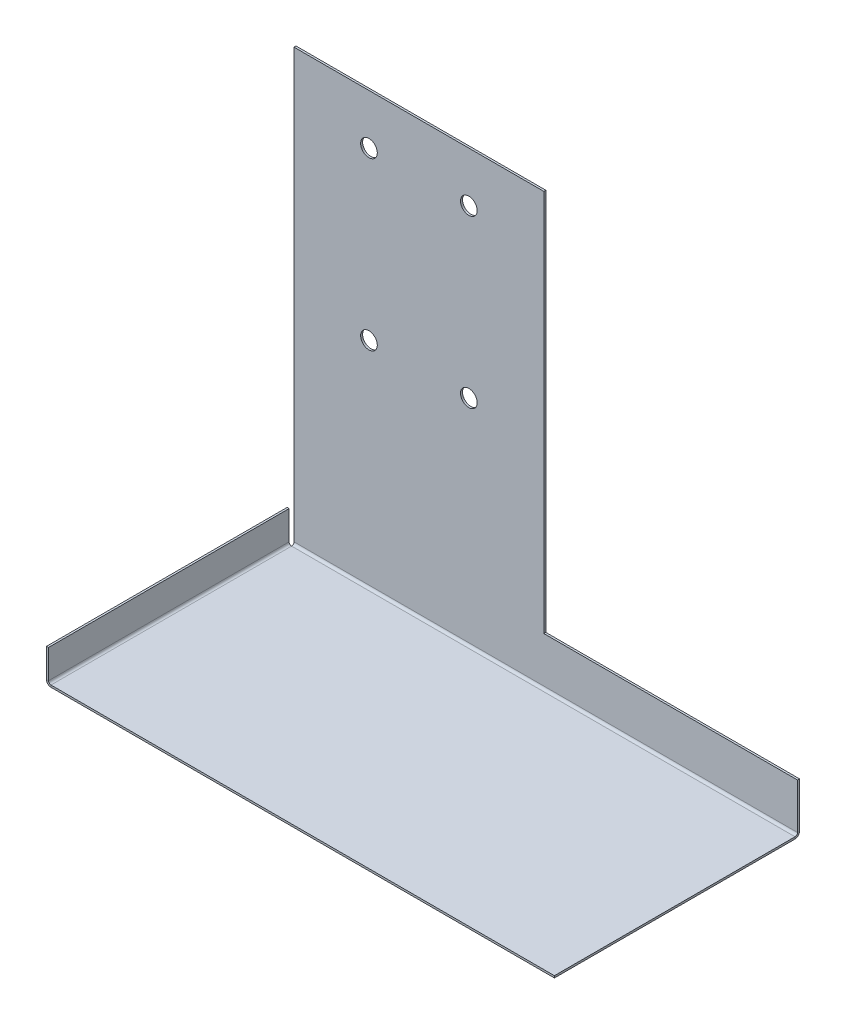
ISO-10303-21;
HEADER;
FILE_DESCRIPTION(('STEP AP214'),'2;1');
FILE_NAME('part.step','',(''),(''),'','','');
FILE_SCHEMA(('AUTOMOTIVE_DESIGN { 1 0 10303 214 1 1 1 1 }'));
ENDSEC;
DATA;
#1=APPLICATION_CONTEXT('core data for automotive mechanical design processes');
#2=APPLICATION_PROTOCOL_DEFINITION('international standard','automotive_design',2000,#1);
#3=PRODUCT_CONTEXT('',#1,'mechanical');
#4=PRODUCT('Part','Part','',(#3));
#5=PRODUCT_RELATED_PRODUCT_CATEGORY('part','',(#4));
#6=PRODUCT_DEFINITION_FORMATION('','',#4);
#7=PRODUCT_DEFINITION_CONTEXT('part definition',#1,'design');
#8=PRODUCT_DEFINITION('design','',#6,#7);
#9=PRODUCT_DEFINITION_SHAPE('','',#8);
#10=(LENGTH_UNIT() NAMED_UNIT(*) SI_UNIT(.MILLI.,.METRE.));
#11=(NAMED_UNIT(*) PLANE_ANGLE_UNIT() SI_UNIT($,.RADIAN.));
#12=(NAMED_UNIT(*) SI_UNIT($,.STERADIAN.) SOLID_ANGLE_UNIT());
#13=UNCERTAINTY_MEASURE_WITH_UNIT(LENGTH_MEASURE(1.E-05),#10,'distance_accuracy_value','');
#14=(GEOMETRIC_REPRESENTATION_CONTEXT(3) GLOBAL_UNCERTAINTY_ASSIGNED_CONTEXT((#13)) GLOBAL_UNIT_ASSIGNED_CONTEXT((#10,
#11,#12)) REPRESENTATION_CONTEXT('',''));
#15=CARTESIAN_POINT('',(0.,0.,0.));
#16=DIRECTION('',(0.,0.,1.));
#17=DIRECTION('',(1.,0.,0.));
#18=AXIS2_PLACEMENT_3D('',#15,#16,#17);
#19=CARTESIAN_POINT('',(0.,0.,-0.6));
#20=DIRECTION('',(0.,0.,-1.));
#21=DIRECTION('',(-1.,0.,0.));
#22=AXIS2_PLACEMENT_3D('',#19,#20,#21);
#23=PLANE('',#22);
#24=DIRECTION('',(1.,0.,0.));
#25=VECTOR('',#24,1.);
#26=CARTESIAN_POINT('',(151.2,1.3366,-0.6));
#27=LINE('',#26,#25);
#28=CARTESIAN_POINT('',(151.2,1.3366,-0.6));
#29=VERTEX_POINT('',#28);
#30=CARTESIAN_POINT('',(75.,1.3366,-0.6));
#31=VERTEX_POINT('',#30);
#32=EDGE_CURVE('E283',#29,#31,#27,.F.);
#33=ORIENTED_EDGE('',*,*,#32,.T.);
#34=DIRECTION('',(0.,1.,0.));
#35=VECTOR('',#34,1.);
#36=CARTESIAN_POINT('',(75.,0.,-0.6));
#37=LINE('',#36,#35);
#38=CARTESIAN_POINT('',(75.,15.,-0.6));
#39=VERTEX_POINT('',#38);
#40=EDGE_CURVE('E13',#31,#39,#37,.T.);
#41=ORIENTED_EDGE('',*,*,#40,.T.);
#42=DIRECTION('',(-1.,0.,0.));
#43=VECTOR('',#42,1.);
#44=CARTESIAN_POINT('',(75.,15.,-0.6));
#45=LINE('',#44,#43);
#46=CARTESIAN_POINT('',(151.2,15.,-0.6));
#47=VERTEX_POINT('',#46);
#48=EDGE_CURVE('E333',#47,#39,#45,.T.);
#49=ORIENTED_EDGE('',*,*,#48,.F.);
#50=DIRECTION('',(0.,1.,0.));
#51=VECTOR('',#50,1.);
#52=CARTESIAN_POINT('',(151.2,0.,-0.6));
#53=LINE('',#52,#51);
#54=EDGE_CURVE('E331',#29,#47,#53,.T.);
#55=ORIENTED_EDGE('',*,*,#54,.F.);
#56=EDGE_LOOP('',(#33,#41,#49,#55));
#57=FACE_BOUND('',#56,.T.);
#58=ADVANCED_FACE('F83',(#57),#23,.T.);
#59=CARTESIAN_POINT('',(0.,0.,0.));
#60=DIRECTION('',(0.,1.,0.));
#61=DIRECTION('',(0.,0.,1.));
#62=AXIS2_PLACEMENT_3D('',#59,#60,#61);
#63=PLANE('',#62);
#64=DIRECTION('',(0.,0.,-1.));
#65=VECTOR('',#64,1.);
#66=CARTESIAN_POINT('',(138.538767605664,0.,0.));
#67=LINE('',#66,#65);
#68=CARTESIAN_POINT('',(138.538767605664,-2.54878137735549E-13,73.));
#69=VERTEX_POINT('',#68);
#70=CARTESIAN_POINT('',(138.538767605664,-2.16898623001696E-13,62.1222346482778));
#71=VERTEX_POINT('',#70);
#72=EDGE_CURVE('E93',#69,#71,#67,.T.);
#73=ORIENTED_EDGE('',*,*,#72,.F.);
#74=DIRECTION('',(-1.,0.,0.));
#75=VECTOR('',#74,1.);
#76=CARTESIAN_POINT('',(0.,-2.54878137735549E-13,73.));
#77=LINE('',#76,#75);
#78=CARTESIAN_POINT('',(0.,-2.53703308361608E-13,73.));
#79=VERTEX_POINT('',#78);
#80=EDGE_CURVE('E258',#69,#79,#77,.T.);
#81=ORIENTED_EDGE('',*,*,#80,.T.);
#82=DIRECTION('',(0.,0.,-1.));
#83=VECTOR('',#82,1.);
#84=CARTESIAN_POINT('',(0.,0.,0.));
#85=LINE('',#84,#83);
#86=CARTESIAN_POINT('',(0.,0.,0.736599999999995));
#87=VERTEX_POINT('',#86);
#88=EDGE_CURVE('E263',#79,#87,#85,.T.);
#89=ORIENTED_EDGE('',*,*,#88,.T.);
#90=DIRECTION('',(1.,0.,0.));
#91=VECTOR('',#90,1.);
#92=CARTESIAN_POINT('',(0.,0.,0.736599999999995));
#93=LINE('',#92,#91);
#94=CARTESIAN_POINT('',(151.2,0.,0.736599999999995));
#95=VERTEX_POINT('',#94);
#96=EDGE_CURVE('E273',#95,#87,#93,.F.);
#97=ORIENTED_EDGE('',*,*,#96,.F.);
#98=DIRECTION('',(0.,0.,1.));
#99=VECTOR('',#98,1.);
#100=CARTESIAN_POINT('',(151.2,0.,0.));
#101=LINE('',#100,#99);
#102=CARTESIAN_POINT('',(151.2,-2.16898623001696E-13,62.1222346482778));
#103=VERTEX_POINT('',#102);
#104=EDGE_CURVE('E259',#95,#103,#101,.T.);
#105=ORIENTED_EDGE('',*,*,#104,.T.);
#106=DIRECTION('',(1.,0.,0.));
#107=VECTOR('',#106,1.);
#108=CARTESIAN_POINT('',(0.,-2.16898623001696E-13,62.1222346482778));
#109=LINE('',#108,#107);
#110=EDGE_CURVE('E357',#71,#103,#109,.T.);
#111=ORIENTED_EDGE('',*,*,#110,.F.);
#112=EDGE_LOOP('',(#73,#81,#89,#97,#105,#111));
#113=FACE_BOUND('',#112,.T.);
#114=ADVANCED_FACE('F421',(#113),#63,.F.);
#115=ORIENTED_EDGE('',*,*,#40,.F.);
#116=CARTESIAN_POINT('',(0.,1.3366,-0.6));
#117=VERTEX_POINT('',#116);
#118=EDGE_CURVE('E287',#31,#117,#27,.F.);
#119=ORIENTED_EDGE('',*,*,#118,.T.);
#120=DIRECTION('',(0.,-1.,0.));
#121=VECTOR('',#120,1.);
#122=CARTESIAN_POINT('',(0.,0.,-0.6));
#123=LINE('',#122,#121);
#124=CARTESIAN_POINT('',(0.,130.,-0.6));
#125=VERTEX_POINT('',#124);
#126=EDGE_CURVE('E387',#125,#117,#123,.T.);
#127=ORIENTED_EDGE('',*,*,#126,.F.);
#128=DIRECTION('',(-1.,0.,0.));
#129=VECTOR('',#128,1.);
#130=CARTESIAN_POINT('',(0.,130.,-0.6));
#131=LINE('',#130,#129);
#132=CARTESIAN_POINT('',(75.,130.,-0.6));
#133=VERTEX_POINT('',#132);
#134=EDGE_CURVE('E376',#133,#125,#131,.T.);
#135=ORIENTED_EDGE('',*,*,#134,.F.);
#136=DIRECTION('',(0.,1.,0.));
#137=VECTOR('',#136,1.);
#138=CARTESIAN_POINT('',(75.,0.,-0.6));
#139=LINE('',#138,#137);
#140=EDGE_CURVE('E346',#39,#133,#139,.T.);
#141=ORIENTED_EDGE('',*,*,#140,.F.);
#142=EDGE_LOOP('',(#115,#119,#127,#135,#141));
#143=FACE_BOUND('',#142,.T.);
#144=CARTESIAN_POINT('',(22.5,65.,-0.6));
#145=DIRECTION('',(0.,0.,-1.));
#146=DIRECTION('',(-1.,0.,0.));
#147=AXIS2_PLACEMENT_3D('',#144,#145,#146);
#148=CIRCLE('',#147,2.5);
#149=CARTESIAN_POINT('',(20.,65.,-0.6));
#150=VERTEX_POINT('',#149);
#151=EDGE_CURVE('E324',#150,#150,#148,.T.);
#152=ORIENTED_EDGE('',*,*,#151,.F.);
#153=EDGE_LOOP('',(#152));
#154=FACE_BOUND('',#153,.T.);
#155=CARTESIAN_POINT('',(52.5,115.,-0.6));
#156=DIRECTION('',(0.,0.,-1.));
#157=DIRECTION('',(-1.,0.,0.));
#158=AXIS2_PLACEMENT_3D('',#155,#156,#157);
#159=CIRCLE('',#158,2.5);
#160=CARTESIAN_POINT('',(50.,115.,-0.6));
#161=VERTEX_POINT('',#160);
#162=EDGE_CURVE('E318',#161,#161,#159,.T.);
#163=ORIENTED_EDGE('',*,*,#162,.F.);
#164=EDGE_LOOP('',(#163));
#165=FACE_BOUND('',#164,.T.);
#166=CARTESIAN_POINT('',(52.5,65.,-0.6));
#167=DIRECTION('',(0.,0.,-1.));
#168=DIRECTION('',(1.,0.,0.));
#169=AXIS2_PLACEMENT_3D('',#166,#167,#168);
#170=CIRCLE('',#169,2.49999999999999);
#171=CARTESIAN_POINT('',(55.,65.,-0.6));
#172=VERTEX_POINT('',#171);
#173=EDGE_CURVE('E312',#172,#172,#170,.T.);
#174=ORIENTED_EDGE('',*,*,#173,.F.);
#175=EDGE_LOOP('',(#174));
#176=FACE_BOUND('',#175,.T.);
#177=CARTESIAN_POINT('',(22.5,115.,-0.6));
#178=DIRECTION('',(0.,0.,-1.));
#179=DIRECTION('',(1.,0.,0.));
#180=AXIS2_PLACEMENT_3D('',#177,#178,#179);
#181=CIRCLE('',#180,2.5);
#182=CARTESIAN_POINT('',(25.,115.,-0.6));
#183=VERTEX_POINT('',#182);
#184=EDGE_CURVE('E304',#183,#183,#181,.T.);
#185=ORIENTED_EDGE('',*,*,#184,.F.);
#186=EDGE_LOOP('',(#185));
#187=FACE_BOUND('',#186,.T.);
#188=ADVANCED_FACE('F400',(#143,#154,#165,#176,#187),#23,.T.);
#189=CARTESIAN_POINT('',(0.,0.,0.));
#190=DIRECTION('',(0.,0.,-1.));
#191=DIRECTION('',(-1.,0.,0.));
#192=AXIS2_PLACEMENT_3D('',#189,#190,#191);
#193=PLANE('',#192);
#194=CARTESIAN_POINT('',(22.5,65.,0.));
#195=DIRECTION('',(0.,0.,-1.));
#196=DIRECTION('',(-1.,0.,0.));
#197=AXIS2_PLACEMENT_3D('',#194,#195,#196);
#198=CIRCLE('',#197,2.5);
#199=CARTESIAN_POINT('',(20.,65.,0.));
#200=VERTEX_POINT('',#199);
#201=EDGE_CURVE('E327',#200,#200,#198,.F.);
#202=ORIENTED_EDGE('',*,*,#201,.F.);
#203=EDGE_LOOP('',(#202));
#204=FACE_BOUND('',#203,.T.);
#205=CARTESIAN_POINT('',(52.5,115.,0.));
#206=DIRECTION('',(0.,0.,-1.));
#207=DIRECTION('',(-1.,0.,0.));
#208=AXIS2_PLACEMENT_3D('',#205,#206,#207);
#209=CIRCLE('',#208,2.5);
#210=CARTESIAN_POINT('',(50.,115.,0.));
#211=VERTEX_POINT('',#210);
#212=EDGE_CURVE('E321',#211,#211,#209,.F.);
#213=ORIENTED_EDGE('',*,*,#212,.F.);
#214=EDGE_LOOP('',(#213));
#215=FACE_BOUND('',#214,.T.);
#216=CARTESIAN_POINT('',(52.5,65.,0.));
#217=DIRECTION('',(0.,0.,-1.));
#218=DIRECTION('',(-1.,0.,0.));
#219=AXIS2_PLACEMENT_3D('',#216,#217,#218);
#220=CIRCLE('',#219,2.49999999999999);
#221=CARTESIAN_POINT('',(50.,65.,0.));
#222=VERTEX_POINT('',#221);
#223=EDGE_CURVE('E315',#222,#222,#220,.F.);
#224=ORIENTED_EDGE('',*,*,#223,.F.);
#225=EDGE_LOOP('',(#224));
#226=FACE_BOUND('',#225,.T.);
#227=CARTESIAN_POINT('',(22.5,115.,0.));
#228=DIRECTION('',(0.,0.,-1.));
#229=DIRECTION('',(-1.,0.,0.));
#230=AXIS2_PLACEMENT_3D('',#227,#228,#229);
#231=CIRCLE('',#230,2.5);
#232=CARTESIAN_POINT('',(20.,115.,0.));
#233=VERTEX_POINT('',#232);
#234=EDGE_CURVE('E309',#233,#233,#231,.F.);
#235=ORIENTED_EDGE('',*,*,#234,.F.);
#236=EDGE_LOOP('',(#235));
#237=FACE_BOUND('',#236,.T.);
#238=DIRECTION('',(1.,0.,0.));
#239=VECTOR('',#238,1.);
#240=CARTESIAN_POINT('',(151.2,1.3366,0.));
#241=LINE('',#240,#239);
#242=CARTESIAN_POINT('',(151.2,1.3366,0.));
#243=VERTEX_POINT('',#242);
#244=CARTESIAN_POINT('',(0.,1.3366,0.));
#245=VERTEX_POINT('',#244);
#246=EDGE_CURVE('E297',#243,#245,#241,.F.);
#247=ORIENTED_EDGE('',*,*,#246,.F.);
#248=DIRECTION('',(0.,1.,0.));
#249=VECTOR('',#248,1.);
#250=CARTESIAN_POINT('',(151.2,0.,0.));
#251=LINE('',#250,#249);
#252=CARTESIAN_POINT('',(151.2,15.,0.));
#253=VERTEX_POINT('',#252);
#254=EDGE_CURVE('E330',#243,#253,#251,.T.);
#255=ORIENTED_EDGE('',*,*,#254,.T.);
#256=DIRECTION('',(-1.,0.,0.));
#257=VECTOR('',#256,1.);
#258=CARTESIAN_POINT('',(75.,15.,0.));
#259=LINE('',#258,#257);
#260=CARTESIAN_POINT('',(75.,15.,0.));
#261=VERTEX_POINT('',#260);
#262=EDGE_CURVE('E334',#253,#261,#259,.T.);
#263=ORIENTED_EDGE('',*,*,#262,.T.);
#264=DIRECTION('',(0.,1.,0.));
#265=VECTOR('',#264,1.);
#266=CARTESIAN_POINT('',(75.,0.,0.));
#267=LINE('',#266,#265);
#268=CARTESIAN_POINT('',(75.,130.,0.));
#269=VERTEX_POINT('',#268);
#270=EDGE_CURVE('E381',#261,#269,#267,.T.);
#271=ORIENTED_EDGE('',*,*,#270,.T.);
#272=DIRECTION('',(-1.,0.,0.));
#273=VECTOR('',#272,1.);
#274=CARTESIAN_POINT('',(0.,130.,0.));
#275=LINE('',#274,#273);
#276=CARTESIAN_POINT('',(0.,130.,0.));
#277=VERTEX_POINT('',#276);
#278=EDGE_CURVE('E379',#269,#277,#275,.T.);
#279=ORIENTED_EDGE('',*,*,#278,.T.);
#280=DIRECTION('',(0.,-1.,0.));
#281=VECTOR('',#280,1.);
#282=CARTESIAN_POINT('',(0.,0.,0.));
#283=LINE('',#282,#281);
#284=EDGE_CURVE('E345',#277,#245,#283,.T.);
#285=ORIENTED_EDGE('',*,*,#284,.T.);
#286=EDGE_LOOP('',(#247,#255,#263,#271,#279,#285));
#287=FACE_BOUND('',#286,.T.);
#288=ADVANCED_FACE('F395',(#204,#215,#226,#237,#287),#193,.F.);
#289=CARTESIAN_POINT('',(151.2,0.,-0.6));
#290=DIRECTION('',(1.,0.,0.));
#291=DIRECTION('',(0.,0.,-1.));
#292=AXIS2_PLACEMENT_3D('',#289,#290,#291);
#293=PLANE('',#292);
#294=ORIENTED_EDGE('',*,*,#254,.F.);
#295=DIRECTION('',(0.,0.,-1.));
#296=VECTOR('',#295,1.);
#297=CARTESIAN_POINT('',(151.2,1.3366,0.));
#298=LINE('',#297,#296);
#299=EDGE_CURVE('E290',#243,#29,#298,.T.);
#300=ORIENTED_EDGE('',*,*,#299,.T.);
#301=ORIENTED_EDGE('',*,*,#54,.T.);
#302=DIRECTION('',(0.,0.,1.));
#303=VECTOR('',#302,1.);
#304=CARTESIAN_POINT('',(151.2,15.,-0.6));
#305=LINE('',#304,#303);
#306=EDGE_CURVE('E338',#47,#253,#305,.T.);
#307=ORIENTED_EDGE('',*,*,#306,.T.);
#308=EDGE_LOOP('',(#294,#300,#301,#307));
#309=FACE_BOUND('',#308,.T.);
#310=ADVANCED_FACE('F411',(#309),#293,.T.);
#311=CARTESIAN_POINT('',(0.,0.,-0.6));
#312=DIRECTION('',(-1.,0.,0.));
#313=DIRECTION('',(0.,0.,1.));
#314=AXIS2_PLACEMENT_3D('',#311,#312,#313);
#315=PLANE('',#314);
#316=DIRECTION('',(0.,0.,-1.));
#317=VECTOR('',#316,1.);
#318=CARTESIAN_POINT('',(0.,1.3366,0.));
#319=LINE('',#318,#317);
#320=EDGE_CURVE('E301',#245,#117,#319,.T.);
#321=ORIENTED_EDGE('',*,*,#320,.F.);
#322=ORIENTED_EDGE('',*,*,#284,.F.);
#323=DIRECTION('',(0.,0.,1.));
#324=VECTOR('',#323,1.);
#325=CARTESIAN_POINT('',(0.,130.,-0.6));
#326=LINE('',#325,#324);
#327=EDGE_CURVE('E360',#125,#277,#326,.T.);
#328=ORIENTED_EDGE('',*,*,#327,.F.);
#329=ORIENTED_EDGE('',*,*,#126,.T.);
#330=EDGE_LOOP('',(#321,#322,#328,#329));
#331=FACE_BOUND('',#330,.T.);
#332=ADVANCED_FACE('F85',(#331),#315,.T.);
#333=CARTESIAN_POINT('',(0.,130.,-0.6));
#334=DIRECTION('',(0.,1.,0.));
#335=DIRECTION('',(0.,0.,1.));
#336=AXIS2_PLACEMENT_3D('',#333,#334,#335);
#337=PLANE('',#336);
#338=ORIENTED_EDGE('',*,*,#278,.F.);
#339=DIRECTION('',(0.,0.,1.));
#340=VECTOR('',#339,1.);
#341=CARTESIAN_POINT('',(75.,130.,-0.6));
#342=LINE('',#341,#340);
#343=EDGE_CURVE('E369',#133,#269,#342,.T.);
#344=ORIENTED_EDGE('',*,*,#343,.F.);
#345=ORIENTED_EDGE('',*,*,#134,.T.);
#346=ORIENTED_EDGE('',*,*,#327,.T.);
#347=EDGE_LOOP('',(#338,#344,#345,#346));
#348=FACE_BOUND('',#347,.T.);
#349=ADVANCED_FACE('F397',(#348),#337,.T.);
#350=CARTESIAN_POINT('',(75.,0.,-0.6));
#351=DIRECTION('',(1.,0.,0.));
#352=DIRECTION('',(0.,0.,-1.));
#353=AXIS2_PLACEMENT_3D('',#350,#351,#352);
#354=PLANE('',#353);
#355=DIRECTION('',(0.,0.,1.));
#356=VECTOR('',#355,1.);
#357=CARTESIAN_POINT('',(75.,15.,-0.6));
#358=LINE('',#357,#356);
#359=EDGE_CURVE('E341',#39,#261,#358,.T.);
#360=ORIENTED_EDGE('',*,*,#359,.F.);
#361=ORIENTED_EDGE('',*,*,#140,.T.);
#362=ORIENTED_EDGE('',*,*,#343,.T.);
#363=ORIENTED_EDGE('',*,*,#270,.F.);
#364=EDGE_LOOP('',(#360,#361,#362,#363));
#365=FACE_BOUND('',#364,.T.);
#366=ADVANCED_FACE('F416',(#365),#354,.T.);
#367=CARTESIAN_POINT('',(75.,15.,-0.6));
#368=DIRECTION('',(0.,1.,0.));
#369=DIRECTION('',(0.,0.,1.));
#370=AXIS2_PLACEMENT_3D('',#367,#368,#369);
#371=PLANE('',#370);
#372=ORIENTED_EDGE('',*,*,#262,.F.);
#373=ORIENTED_EDGE('',*,*,#306,.F.);
#374=ORIENTED_EDGE('',*,*,#48,.T.);
#375=ORIENTED_EDGE('',*,*,#359,.T.);
#376=EDGE_LOOP('',(#372,#373,#374,#375));
#377=FACE_BOUND('',#376,.T.);
#378=ADVANCED_FACE('F442',(#377),#371,.T.);
#379=CARTESIAN_POINT('',(22.5,65.,0.00105000000000005));
#380=DIRECTION('',(0.,0.,-1.));
#381=DIRECTION('',(-1.,0.,0.));
#382=AXIS2_PLACEMENT_3D('',#379,#380,#381);
#383=CYLINDRICAL_SURFACE('',#382,2.5);
#384=ORIENTED_EDGE('',*,*,#151,.T.);
#385=EDGE_LOOP('',(#384));
#386=FACE_BOUND('',#385,.T.);
#387=ORIENTED_EDGE('',*,*,#201,.T.);
#388=EDGE_LOOP('',(#387));
#389=FACE_BOUND('',#388,.T.);
#390=ADVANCED_FACE('F446',(#386,#389),#383,.F.);
#391=CARTESIAN_POINT('',(52.5,115.,0.00105000000000005));
#392=DIRECTION('',(0.,0.,-1.));
#393=DIRECTION('',(-1.,0.,0.));
#394=AXIS2_PLACEMENT_3D('',#391,#392,#393);
#395=CYLINDRICAL_SURFACE('',#394,2.5);
#396=ORIENTED_EDGE('',*,*,#162,.T.);
#397=EDGE_LOOP('',(#396));
#398=FACE_BOUND('',#397,.T.);
#399=ORIENTED_EDGE('',*,*,#212,.T.);
#400=EDGE_LOOP('',(#399));
#401=FACE_BOUND('',#400,.T.);
#402=ADVANCED_FACE('F521',(#398,#401),#395,.F.);
#403=CARTESIAN_POINT('',(52.5,65.,0.00105000000000005));
#404=DIRECTION('',(0.,0.,-1.));
#405=DIRECTION('',(-1.,0.,0.));
#406=AXIS2_PLACEMENT_3D('',#403,#404,#405);
#407=CYLINDRICAL_SURFACE('',#406,2.49999999999999);
#408=ORIENTED_EDGE('',*,*,#173,.T.);
#409=EDGE_LOOP('',(#408));
#410=FACE_BOUND('',#409,.T.);
#411=ORIENTED_EDGE('',*,*,#223,.T.);
#412=EDGE_LOOP('',(#411));
#413=FACE_BOUND('',#412,.T.);
#414=ADVANCED_FACE('F517',(#410,#413),#407,.F.);
#415=CARTESIAN_POINT('',(22.5,115.,0.00105000000000005));
#416=DIRECTION('',(0.,0.,-1.));
#417=DIRECTION('',(-1.,0.,0.));
#418=AXIS2_PLACEMENT_3D('',#415,#416,#417);
#419=CYLINDRICAL_SURFACE('',#418,2.5);
#420=ORIENTED_EDGE('',*,*,#184,.T.);
#421=EDGE_LOOP('',(#420));
#422=FACE_BOUND('',#421,.T.);
#423=ORIENTED_EDGE('',*,*,#234,.T.);
#424=EDGE_LOOP('',(#423));
#425=FACE_BOUND('',#424,.T.);
#426=ADVANCED_FACE('F512',(#422,#425),#419,.F.);
#427=CARTESIAN_POINT('',(0.,1.3366,0.7366));
#428=DIRECTION('',(-1.,0.,0.));
#429=DIRECTION('',(0.,0.,1.));
#430=AXIS2_PLACEMENT_3D('',#427,#428,#429);
#431=PLANE('',#430);
#432=DIRECTION('',(0.,1.,0.));
#433=VECTOR('',#432,1.);
#434=CARTESIAN_POINT('',(0.,0.,0.736599999999995));
#435=LINE('',#434,#433);
#436=CARTESIAN_POINT('',(0.,0.600000000000001,0.736600000000004));
#437=VERTEX_POINT('',#436);
#438=EDGE_CURVE('E240',#437,#87,#435,.F.);
#439=ORIENTED_EDGE('',*,*,#438,.F.);
#440=CARTESIAN_POINT('',(0.,1.3366,0.7366));
#441=DIRECTION('',(1.,0.,0.));
#442=DIRECTION('',(0.,0.,-1.));
#443=AXIS2_PLACEMENT_3D('',#440,#441,#442);
#444=CIRCLE('',#443,0.7366);
#445=EDGE_CURVE('E294',#245,#437,#444,.F.);
#446=ORIENTED_EDGE('',*,*,#445,.F.);
#447=ORIENTED_EDGE('',*,*,#320,.T.);
#448=CARTESIAN_POINT('',(0.,1.3366,0.7366));
#449=DIRECTION('',(1.,0.,0.));
#450=DIRECTION('',(0.,0.,-1.));
#451=AXIS2_PLACEMENT_3D('',#448,#449,#450);
#452=CIRCLE('',#451,1.3366);
#453=EDGE_CURVE('E286',#117,#87,#452,.F.);
#454=ORIENTED_EDGE('',*,*,#453,.T.);
#455=EDGE_LOOP('',(#439,#446,#447,#454));
#456=FACE_BOUND('',#455,.T.);
#457=ADVANCED_FACE('F409',(#456),#431,.T.);
#458=CARTESIAN_POINT('',(151.2,1.3366,0.7366));
#459=DIRECTION('',(-1.,0.,0.));
#460=DIRECTION('',(0.,0.,1.));
#461=AXIS2_PLACEMENT_3D('',#458,#459,#460);
#462=PLANE('',#461);
#463=CARTESIAN_POINT('',(151.2,1.3366,0.7366));
#464=DIRECTION('',(1.,0.,0.));
#465=DIRECTION('',(0.,0.,-1.));
#466=AXIS2_PLACEMENT_3D('',#463,#464,#465);
#467=CIRCLE('',#466,0.7366);
#468=CARTESIAN_POINT('',(151.2,0.599999999999997,0.736599999999997));
#469=VERTEX_POINT('',#468);
#470=EDGE_CURVE('E253',#469,#243,#467,.T.);
#471=ORIENTED_EDGE('',*,*,#470,.F.);
#472=DIRECTION('',(0.,1.,0.));
#473=VECTOR('',#472,1.);
#474=CARTESIAN_POINT('',(151.2,0.599999999999997,0.736599999999997));
#475=LINE('',#474,#473);
#476=EDGE_CURVE('E276',#469,#95,#475,.F.);
#477=ORIENTED_EDGE('',*,*,#476,.T.);
#478=CARTESIAN_POINT('',(151.2,1.3366,0.7366));
#479=DIRECTION('',(1.,0.,0.));
#480=DIRECTION('',(0.,0.,-1.));
#481=AXIS2_PLACEMENT_3D('',#478,#479,#480);
#482=CIRCLE('',#481,1.3366);
#483=EDGE_CURVE('E291',#95,#29,#482,.T.);
#484=ORIENTED_EDGE('',*,*,#483,.T.);
#485=ORIENTED_EDGE('',*,*,#299,.F.);
#486=EDGE_LOOP('',(#471,#477,#484,#485));
#487=FACE_BOUND('',#486,.T.);
#488=ADVANCED_FACE('F458',(#487),#462,.F.);
#489=CARTESIAN_POINT('',(151.2,1.3366,0.7366));
#490=DIRECTION('',(1.,0.,0.));
#491=DIRECTION('',(0.,-1.,0.));
#492=AXIS2_PLACEMENT_3D('',#489,#490,#491);
#493=CYLINDRICAL_SURFACE('',#492,1.3366);
#494=ORIENTED_EDGE('',*,*,#32,.F.);
#495=ORIENTED_EDGE('',*,*,#483,.F.);
#496=ORIENTED_EDGE('',*,*,#96,.T.);
#497=ORIENTED_EDGE('',*,*,#453,.F.);
#498=ORIENTED_EDGE('',*,*,#118,.F.);
#499=EDGE_LOOP('',(#494,#495,#496,#497,#498));
#500=FACE_BOUND('',#499,.T.);
#501=ADVANCED_FACE('F404',(#500),#493,.T.);
#502=CARTESIAN_POINT('',(151.2,1.3366,0.7366));
#503=DIRECTION('',(1.,0.,0.));
#504=DIRECTION('',(0.,-1.,0.));
#505=AXIS2_PLACEMENT_3D('',#502,#503,#504);
#506=CYLINDRICAL_SURFACE('',#505,0.7366);
#507=ORIENTED_EDGE('',*,*,#246,.T.);
#508=ORIENTED_EDGE('',*,*,#445,.T.);
#509=DIRECTION('',(1.,0.,0.));
#510=VECTOR('',#509,1.);
#511=CARTESIAN_POINT('',(0.,0.599999999999997,0.736599999999997));
#512=LINE('',#511,#510);
#513=EDGE_CURVE('E279',#437,#469,#512,.T.);
#514=ORIENTED_EDGE('',*,*,#513,.T.);
#515=ORIENTED_EDGE('',*,*,#470,.T.);
#516=EDGE_LOOP('',(#507,#508,#514,#515));
#517=FACE_BOUND('',#516,.T.);
#518=ADVANCED_FACE('F492',(#517),#506,.F.);
#519=CARTESIAN_POINT('',(151.2,-2.54895930751342E-13,73.));
#520=DIRECTION('',(-1.,0.,0.));
#521=DIRECTION('',(0.,0.,1.));
#522=AXIS2_PLACEMENT_3D('',#519,#520,#521);
#523=PLANE('',#522);
#524=ORIENTED_EDGE('',*,*,#476,.F.);
#525=DIRECTION('',(0.,0.,-1.));
#526=VECTOR('',#525,1.);
#527=CARTESIAN_POINT('',(151.2,0.599999999999745,73.));
#528=LINE('',#527,#526);
#529=CARTESIAN_POINT('',(151.2,0.599999999999745,73.));
#530=VERTEX_POINT('',#529);
#531=EDGE_CURVE('E269',#469,#530,#528,.F.);
#532=ORIENTED_EDGE('',*,*,#531,.T.);
#533=DIRECTION('',(0.,1.,0.));
#534=VECTOR('',#533,1.);
#535=CARTESIAN_POINT('',(151.2,-2.54895930751342E-13,73.));
#536=LINE('',#535,#534);
#537=CARTESIAN_POINT('',(151.2,-2.54878137735549E-13,73.));
#538=VERTEX_POINT('',#537);
#539=EDGE_CURVE('E250',#538,#530,#536,.T.);
#540=ORIENTED_EDGE('',*,*,#539,.F.);
#541=EDGE_CURVE('E262',#103,#538,#101,.T.);
#542=ORIENTED_EDGE('',*,*,#541,.F.);
#543=ORIENTED_EDGE('',*,*,#104,.F.);
#544=EDGE_LOOP('',(#524,#532,#540,#542,#543));
#545=FACE_BOUND('',#544,.T.);
#546=ADVANCED_FACE('F464',(#545),#523,.F.);
#547=EDGE_CURVE('E256',#538,#69,#77,.T.);
#548=ORIENTED_EDGE('',*,*,#547,.T.);
#549=ORIENTED_EDGE('',*,*,#72,.T.);
#550=ORIENTED_EDGE('',*,*,#110,.T.);
#551=ORIENTED_EDGE('',*,*,#541,.T.);
#552=EDGE_LOOP('',(#548,#549,#550,#551));
#553=FACE_BOUND('',#552,.T.);
#554=ADVANCED_FACE('F430',(#553),#63,.F.);
#555=CARTESIAN_POINT('',(0.,0.6,0.));
#556=DIRECTION('',(0.,1.,0.));
#557=DIRECTION('',(0.,0.,1.));
#558=AXIS2_PLACEMENT_3D('',#555,#556,#557);
#559=PLANE('',#558);
#560=ORIENTED_EDGE('',*,*,#531,.F.);
#561=ORIENTED_EDGE('',*,*,#513,.F.);
#562=DIRECTION('',(0.,0.,1.));
#563=VECTOR('',#562,1.);
#564=CARTESIAN_POINT('',(0.,0.6,0.));
#565=LINE('',#564,#563);
#566=CARTESIAN_POINT('',(0.,0.599999999999746,73.));
#567=VERTEX_POINT('',#566);
#568=EDGE_CURVE('E271',#567,#437,#565,.F.);
#569=ORIENTED_EDGE('',*,*,#568,.F.);
#570=DIRECTION('',(1.,0.,0.));
#571=VECTOR('',#570,1.);
#572=CARTESIAN_POINT('',(0.,0.599999999999745,73.));
#573=LINE('',#572,#571);
#574=EDGE_CURVE('E266',#530,#567,#573,.F.);
#575=ORIENTED_EDGE('',*,*,#574,.F.);
#576=EDGE_LOOP('',(#560,#561,#569,#575));
#577=FACE_BOUND('',#576,.T.);
#578=ADVANCED_FACE('F494',(#577),#559,.T.);
#579=CARTESIAN_POINT('',(0.,-2.54895930751342E-13,73.));
#580=DIRECTION('',(0.,0.,-1.));
#581=DIRECTION('',(0.,1.,0.));
#582=AXIS2_PLACEMENT_3D('',#579,#580,#581);
#583=PLANE('',#582);
#584=ORIENTED_EDGE('',*,*,#574,.T.);
#585=DIRECTION('',(0.,1.,0.));
#586=VECTOR('',#585,1.);
#587=CARTESIAN_POINT('',(0.,-2.54878137735549E-13,73.));
#588=LINE('',#587,#586);
#589=EDGE_CURVE('E254',#79,#567,#588,.T.);
#590=ORIENTED_EDGE('',*,*,#589,.F.);
#591=ORIENTED_EDGE('',*,*,#80,.F.);
#592=ORIENTED_EDGE('',*,*,#547,.F.);
#593=ORIENTED_EDGE('',*,*,#539,.T.);
#594=EDGE_LOOP('',(#584,#590,#591,#592,#593));
#595=FACE_BOUND('',#594,.T.);
#596=ADVANCED_FACE('F469',(#595),#583,.F.);
#597=CARTESIAN_POINT('',(0.,1.3366,0.736600000000004));
#598=DIRECTION('',(0.,0.,-1.));
#599=DIRECTION('',(0.,1.,0.));
#600=AXIS2_PLACEMENT_3D('',#597,#598,#599);
#601=PLANE('',#600);
#602=DIRECTION('',(1.,0.,0.));
#603=VECTOR('',#602,1.);
#604=CARTESIAN_POINT('',(-1.3366,1.33659999999999,0.7366));
#605=LINE('',#604,#603);
#606=CARTESIAN_POINT('',(-0.7366,1.3366,0.736600000000004));
#607=VERTEX_POINT('',#606);
#608=CARTESIAN_POINT('',(-1.3366,1.33659999999999,0.736600000000004));
#609=VERTEX_POINT('',#608);
#610=EDGE_CURVE('E219',#607,#609,#605,.F.);
#611=ORIENTED_EDGE('',*,*,#610,.F.);
#612=CARTESIAN_POINT('',(0.,1.3366,0.736600000000004));
#613=DIRECTION('',(0.,0.,1.));
#614=DIRECTION('',(0.,-1.,0.));
#615=AXIS2_PLACEMENT_3D('',#612,#613,#614);
#616=CIRCLE('',#615,0.736599999999997);
#617=EDGE_CURVE('E244',#437,#607,#616,.F.);
#618=ORIENTED_EDGE('',*,*,#617,.F.);
#619=ORIENTED_EDGE('',*,*,#438,.T.);
#620=CARTESIAN_POINT('',(0.,1.3366,0.736600000000004));
#621=DIRECTION('',(0.,0.,1.));
#622=DIRECTION('',(0.,-1.,0.));
#623=AXIS2_PLACEMENT_3D('',#620,#621,#622);
#624=CIRCLE('',#623,1.3366);
#625=EDGE_CURVE('E237',#87,#609,#624,.F.);
#626=ORIENTED_EDGE('',*,*,#625,.T.);
#627=EDGE_LOOP('',(#611,#618,#619,#626));
#628=FACE_BOUND('',#627,.T.);
#629=ADVANCED_FACE('F489',(#628),#601,.T.);
#630=CARTESIAN_POINT('',(0.,1.33659999999974,73.));
#631=DIRECTION('',(0.,0.,-1.));
#632=DIRECTION('',(0.,1.,0.));
#633=AXIS2_PLACEMENT_3D('',#630,#631,#632);
#634=PLANE('',#633);
#635=CARTESIAN_POINT('',(0.,1.33659999999974,73.));
#636=DIRECTION('',(0.,0.,1.));
#637=DIRECTION('',(0.,-1.,0.));
#638=AXIS2_PLACEMENT_3D('',#635,#636,#637);
#639=CIRCLE('',#638,0.736599999999997);
#640=CARTESIAN_POINT('',(-0.736599999999995,1.33659999999974,73.));
#641=VERTEX_POINT('',#640);
#642=EDGE_CURVE('E247',#641,#567,#639,.T.);
#643=ORIENTED_EDGE('',*,*,#642,.F.);
#644=DIRECTION('',(1.,0.,0.));
#645=VECTOR('',#644,1.);
#646=CARTESIAN_POINT('',(-0.7366,1.33659999999974,73.));
#647=LINE('',#646,#645);
#648=CARTESIAN_POINT('',(-1.3366,1.33659999999974,73.));
#649=VERTEX_POINT('',#648);
#650=EDGE_CURVE('E231',#641,#649,#647,.F.);
#651=ORIENTED_EDGE('',*,*,#650,.T.);
#652=CARTESIAN_POINT('',(0.,1.33659999999974,73.));
#653=DIRECTION('',(0.,0.,1.));
#654=DIRECTION('',(0.,-1.,0.));
#655=AXIS2_PLACEMENT_3D('',#652,#653,#654);
#656=CIRCLE('',#655,1.3366);
#657=EDGE_CURVE('E241',#649,#79,#656,.T.);
#658=ORIENTED_EDGE('',*,*,#657,.T.);
#659=ORIENTED_EDGE('',*,*,#589,.T.);
#660=EDGE_LOOP('',(#643,#651,#658,#659));
#661=FACE_BOUND('',#660,.T.);
#662=ADVANCED_FACE('F475',(#661),#634,.F.);
#663=CARTESIAN_POINT('',(0.,1.33659999999974,73.));
#664=DIRECTION('',(0.,0.,1.));
#665=DIRECTION('',(-1.,0.,0.));
#666=AXIS2_PLACEMENT_3D('',#663,#664,#665);
#667=CYLINDRICAL_SURFACE('',#666,1.3366);
#668=ORIENTED_EDGE('',*,*,#88,.F.);
#669=ORIENTED_EDGE('',*,*,#657,.F.);
#670=DIRECTION('',(0.,0.,1.));
#671=VECTOR('',#670,1.);
#672=CARTESIAN_POINT('',(-1.3366,1.33659999999999,0.736600000000014));
#673=LINE('',#672,#671);
#674=EDGE_CURVE('E229',#649,#609,#673,.F.);
#675=ORIENTED_EDGE('',*,*,#674,.T.);
#676=ORIENTED_EDGE('',*,*,#625,.F.);
#677=EDGE_LOOP('',(#668,#669,#675,#676));
#678=FACE_BOUND('',#677,.T.);
#679=ADVANCED_FACE('F487',(#678),#667,.T.);
#680=CARTESIAN_POINT('',(0.,1.33659999999974,73.));
#681=DIRECTION('',(0.,0.,1.));
#682=DIRECTION('',(-1.,0.,0.));
#683=AXIS2_PLACEMENT_3D('',#680,#681,#682);
#684=CYLINDRICAL_SURFACE('',#683,0.736599999999997);
#685=ORIENTED_EDGE('',*,*,#568,.T.);
#686=ORIENTED_EDGE('',*,*,#617,.T.);
#687=DIRECTION('',(0.,0.,1.));
#688=VECTOR('',#687,1.);
#689=CARTESIAN_POINT('',(-0.7366,1.33659999999999,0.736600000000014));
#690=LINE('',#689,#688);
#691=EDGE_CURVE('E234',#607,#641,#690,.T.);
#692=ORIENTED_EDGE('',*,*,#691,.T.);
#693=ORIENTED_EDGE('',*,*,#642,.T.);
#694=EDGE_LOOP('',(#685,#686,#692,#693));
#695=FACE_BOUND('',#694,.T.);
#696=ADVANCED_FACE('F478',(#695),#684,.F.);
#697=CARTESIAN_POINT('',(-1.33660000000003,9.99999999999975,73.));
#698=DIRECTION('',(0.,0.,-1.));
#699=DIRECTION('',(0.,1.,0.));
#700=AXIS2_PLACEMENT_3D('',#697,#698,#699);
#701=PLANE('',#700);
#702=ORIENTED_EDGE('',*,*,#650,.F.);
#703=DIRECTION('',(0.,-1.,0.));
#704=VECTOR('',#703,1.);
#705=CARTESIAN_POINT('',(-0.73660000000003,9.99999999999975,73.));
#706=LINE('',#705,#704);
#707=CARTESIAN_POINT('',(-0.73660000000003,9.99999999999975,73.));
#708=VERTEX_POINT('',#707);
#709=EDGE_CURVE('E227',#641,#708,#706,.F.);
#710=ORIENTED_EDGE('',*,*,#709,.T.);
#711=DIRECTION('',(1.,0.,0.));
#712=VECTOR('',#711,1.);
#713=CARTESIAN_POINT('',(-1.33660000000003,9.99999999999975,73.));
#714=LINE('',#713,#712);
#715=CARTESIAN_POINT('',(-1.33660000000003,9.99999999999975,73.));
#716=VERTEX_POINT('',#715);
#717=EDGE_CURVE('E215',#716,#708,#714,.T.);
#718=ORIENTED_EDGE('',*,*,#717,.F.);
#719=DIRECTION('',(0.,1.,0.));
#720=VECTOR('',#719,1.);
#721=CARTESIAN_POINT('',(-1.3366,-2.17643507945956E-13,73.));
#722=LINE('',#721,#720);
#723=EDGE_CURVE('E202',#649,#716,#722,.T.);
#724=ORIENTED_EDGE('',*,*,#723,.F.);
#725=EDGE_LOOP('',(#702,#710,#718,#724));
#726=FACE_BOUND('',#725,.T.);
#727=ADVANCED_FACE('F485',(#726),#701,.F.);
#728=CARTESIAN_POINT('',(-1.3366,0.599999999999995,0.736599999999997));
#729=DIRECTION('',(0.,0.,1.));
#730=DIRECTION('',(0.,-1.,0.));
#731=AXIS2_PLACEMENT_3D('',#728,#729,#730);
#732=PLANE('',#731);
#733=ORIENTED_EDGE('',*,*,#610,.T.);
#734=DIRECTION('',(0.,-1.,0.));
#735=VECTOR('',#734,1.);
#736=CARTESIAN_POINT('',(-1.3366,0.,0.736599999999995));
#737=LINE('',#736,#735);
#738=CARTESIAN_POINT('',(-1.33660000000003,10.,0.73660000000003));
#739=VERTEX_POINT('',#738);
#740=EDGE_CURVE('E200',#739,#609,#737,.T.);
#741=ORIENTED_EDGE('',*,*,#740,.F.);
#742=DIRECTION('',(1.,0.,0.));
#743=VECTOR('',#742,1.);
#744=CARTESIAN_POINT('',(-1.33660000000003,10.,0.73660000000003));
#745=LINE('',#744,#743);
#746=CARTESIAN_POINT('',(-0.73660000000003,10.,0.73660000000003));
#747=VERTEX_POINT('',#746);
#748=EDGE_CURVE('E208',#739,#747,#745,.T.);
#749=ORIENTED_EDGE('',*,*,#748,.T.);
#750=DIRECTION('',(0.,1.,0.));
#751=VECTOR('',#750,1.);
#752=CARTESIAN_POINT('',(-0.736599999999997,0.599999999999997,0.736599999999997));
#753=LINE('',#752,#751);
#754=EDGE_CURVE('E224',#747,#607,#753,.F.);
#755=ORIENTED_EDGE('',*,*,#754,.T.);
#756=EDGE_LOOP('',(#733,#741,#749,#755));
#757=FACE_BOUND('',#756,.T.);
#758=ADVANCED_FACE('F218',(#757),#732,.F.);
#759=CARTESIAN_POINT('',(-1.3366,0.,0.));
#760=DIRECTION('',(1.,0.,0.));
#761=DIRECTION('',(0.,1.,0.));
#762=AXIS2_PLACEMENT_3D('',#759,#760,#761);
#763=PLANE('',#762);
#764=ORIENTED_EDGE('',*,*,#674,.F.);
#765=ORIENTED_EDGE('',*,*,#723,.T.);
#766=DIRECTION('',(0.,0.,-1.));
#767=VECTOR('',#766,1.);
#768=CARTESIAN_POINT('',(-1.33660000000003,10.,0.));
#769=LINE('',#768,#767);
#770=EDGE_CURVE('E195',#716,#739,#769,.T.);
#771=ORIENTED_EDGE('',*,*,#770,.T.);
#772=ORIENTED_EDGE('',*,*,#740,.T.);
#773=EDGE_LOOP('',(#764,#765,#771,#772));
#774=FACE_BOUND('',#773,.T.);
#775=ADVANCED_FACE('F198',(#774),#763,.F.);
#776=CARTESIAN_POINT('',(-0.736599999999995,0.,0.));
#777=DIRECTION('',(1.,0.,0.));
#778=DIRECTION('',(0.,1.,0.));
#779=AXIS2_PLACEMENT_3D('',#776,#777,#778);
#780=PLANE('',#779);
#781=ORIENTED_EDGE('',*,*,#709,.F.);
#782=ORIENTED_EDGE('',*,*,#691,.F.);
#783=ORIENTED_EDGE('',*,*,#754,.F.);
#784=DIRECTION('',(0.,0.,1.));
#785=VECTOR('',#784,1.);
#786=CARTESIAN_POINT('',(-0.73660000000003,10.,0.73660000000003));
#787=LINE('',#786,#785);
#788=EDGE_CURVE('E211',#708,#747,#787,.F.);
#789=ORIENTED_EDGE('',*,*,#788,.F.);
#790=EDGE_LOOP('',(#781,#782,#783,#789));
#791=FACE_BOUND('',#790,.T.);
#792=ADVANCED_FACE('F483',(#791),#780,.T.);
#793=CARTESIAN_POINT('',(-1.33660000000003,10.,0.73660000000003));
#794=DIRECTION('',(0.,-1.,0.));
#795=DIRECTION('',(0.,0.,-1.));
#796=AXIS2_PLACEMENT_3D('',#793,#794,#795);
#797=PLANE('',#796);
#798=ORIENTED_EDGE('',*,*,#788,.T.);
#799=ORIENTED_EDGE('',*,*,#748,.F.);
#800=ORIENTED_EDGE('',*,*,#770,.F.);
#801=ORIENTED_EDGE('',*,*,#717,.T.);
#802=EDGE_LOOP('',(#798,#799,#800,#801));
#803=FACE_BOUND('',#802,.T.);
#804=ADVANCED_FACE('F209',(#803),#797,.F.);
#805=CLOSED_SHELL('',(#58,#114,#188,#288,#310,#332,#349,#366,#378,#390,#402,#414,#426,#457,#488,
#501,#518,#546,#554,#578,#596,#629,#662,#679,#696,#727,#758,#775,#792,#804));
#806=MANIFOLD_SOLID_BREP('B2',#805);
#807=ADVANCED_BREP_SHAPE_REPRESENTATION('',(#18,#806),#14);
#808=SHAPE_DEFINITION_REPRESENTATION(#9,#807);
ENDSEC;
END-ISO-10303-21;
